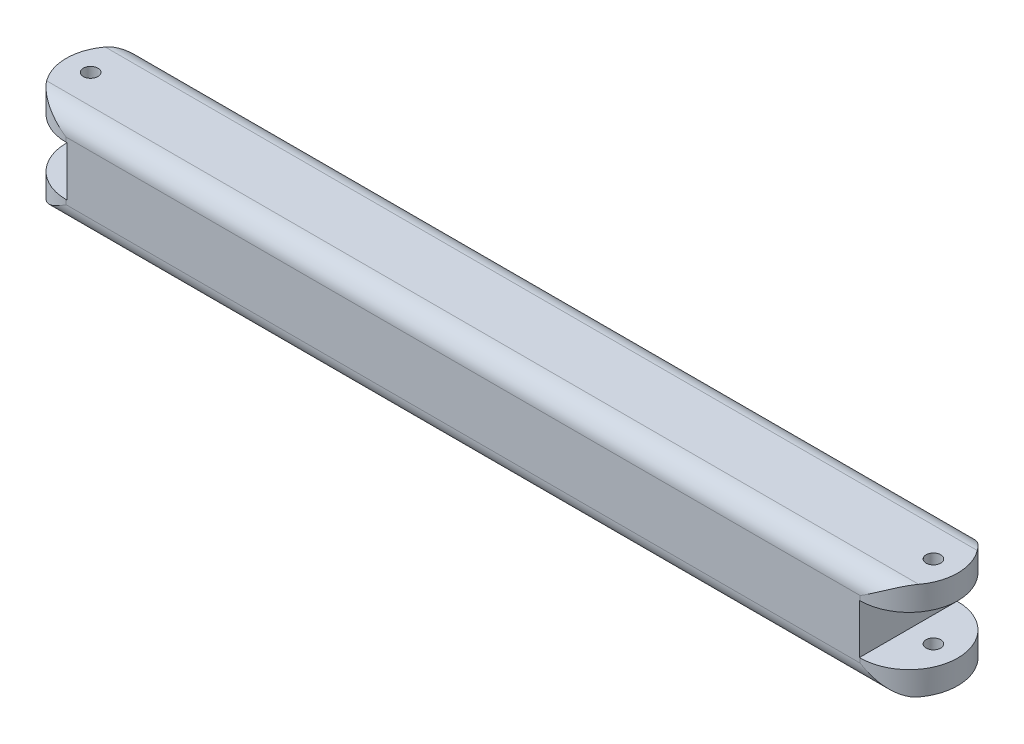
ISO-10303-21;
HEADER;
FILE_DESCRIPTION(('STEP AP214'),'2;1');
FILE_NAME('part.step','',(''),(''),'','','');
FILE_SCHEMA(('AUTOMOTIVE_DESIGN { 1 0 10303 214 1 1 1 1 }'));
ENDSEC;
DATA;
#1=APPLICATION_CONTEXT('core data for automotive mechanical design processes');
#2=APPLICATION_PROTOCOL_DEFINITION('international standard','automotive_design',2000,#1);
#3=PRODUCT_CONTEXT('',#1,'mechanical');
#4=PRODUCT('Part','Part','',(#3));
#5=PRODUCT_RELATED_PRODUCT_CATEGORY('part','',(#4));
#6=PRODUCT_DEFINITION_FORMATION('','',#4);
#7=PRODUCT_DEFINITION_CONTEXT('part definition',#1,'design');
#8=PRODUCT_DEFINITION('design','',#6,#7);
#9=PRODUCT_DEFINITION_SHAPE('','',#8);
#10=(LENGTH_UNIT() NAMED_UNIT(*) SI_UNIT(.MILLI.,.METRE.));
#11=(NAMED_UNIT(*) PLANE_ANGLE_UNIT() SI_UNIT($,.RADIAN.));
#12=(NAMED_UNIT(*) SI_UNIT($,.STERADIAN.) SOLID_ANGLE_UNIT());
#13=UNCERTAINTY_MEASURE_WITH_UNIT(LENGTH_MEASURE(1.E-05),#10,'distance_accuracy_value','');
#14=(GEOMETRIC_REPRESENTATION_CONTEXT(3) GLOBAL_UNCERTAINTY_ASSIGNED_CONTEXT((#13)) GLOBAL_UNIT_ASSIGNED_CONTEXT((#10,
#11,#12)) REPRESENTATION_CONTEXT('',''));
#15=CARTESIAN_POINT('',(0.,0.,0.));
#16=DIRECTION('',(0.,0.,1.));
#17=DIRECTION('',(1.,0.,0.));
#18=AXIS2_PLACEMENT_3D('',#15,#16,#17);
#19=CARTESIAN_POINT('',(228.4,-25.,15.));
#20=DIRECTION('',(0.,1.,0.));
#21=DIRECTION('',(0.,0.,1.));
#22=AXIS2_PLACEMENT_3D('',#19,#20,#21);
#23=PLANE('',#22);
#24=CARTESIAN_POINT('',(215.9,-25.,0.));
#25=DIRECTION('',(0.,1.,0.));
#26=DIRECTION('',(0.,0.,1.));
#27=AXIS2_PLACEMENT_3D('',#24,#25,#26);
#28=CIRCLE('',#27,3.75000000000001);
#29=CARTESIAN_POINT('',(215.9,-25.,3.75000000000001));
#30=VERTEX_POINT('',#29);
#31=EDGE_CURVE('E550',#30,#30,#28,.T.);
#32=ORIENTED_EDGE('',*,*,#31,.T.);
#33=EDGE_LOOP('',(#32));
#34=FACE_BOUND('',#33,.T.);
#35=CARTESIAN_POINT('',(-215.9,-25.,0.));
#36=DIRECTION('',(0.,1.,0.));
#37=DIRECTION('',(0.,0.,1.));
#38=AXIS2_PLACEMENT_3D('',#35,#36,#37);
#39=CIRCLE('',#38,3.75000000000001);
#40=CARTESIAN_POINT('',(-215.9,-25.,3.75000000000001));
#41=VERTEX_POINT('',#40);
#42=EDGE_CURVE('E156',#41,#41,#39,.T.);
#43=ORIENTED_EDGE('',*,*,#42,.T.);
#44=EDGE_LOOP('',(#43));
#45=FACE_BOUND('',#44,.T.);
#46=DIRECTION('',(-1.,0.,0.));
#47=VECTOR('',#46,1.);
#48=CARTESIAN_POINT('',(228.4,-25.,-15.));
#49=LINE('',#48,#47);
#50=CARTESIAN_POINT('',(223.4,-25.,-15.));
#51=VERTEX_POINT('',#50);
#52=CARTESIAN_POINT('',(-223.4,-25.,-15.));
#53=VERTEX_POINT('',#52);
#54=EDGE_CURVE('E182',#51,#53,#49,.T.);
#55=ORIENTED_EDGE('',*,*,#54,.F.);
#56=CARTESIAN_POINT('',(203.4,-25.,0.));
#57=DIRECTION('',(0.,-1.,0.));
#58=DIRECTION('',(0.,0.,-1.));
#59=AXIS2_PLACEMENT_3D('',#56,#57,#58);
#60=CIRCLE('',#59,25.);
#61=CARTESIAN_POINT('',(223.4,-25.,15.));
#62=VERTEX_POINT('',#61);
#63=EDGE_CURVE('E155',#51,#62,#60,.T.);
#64=ORIENTED_EDGE('',*,*,#63,.T.);
#65=DIRECTION('',(-1.,0.,0.));
#66=VECTOR('',#65,1.);
#67=CARTESIAN_POINT('',(228.4,-25.,15.));
#68=LINE('',#67,#66);
#69=CARTESIAN_POINT('',(-223.4,-25.,15.));
#70=VERTEX_POINT('',#69);
#71=EDGE_CURVE('E185',#62,#70,#68,.T.);
#72=ORIENTED_EDGE('',*,*,#71,.T.);
#73=CARTESIAN_POINT('',(-203.4,-25.,0.));
#74=DIRECTION('',(0.,-1.,0.));
#75=DIRECTION('',(0.,0.,1.));
#76=AXIS2_PLACEMENT_3D('',#73,#74,#75);
#77=CIRCLE('',#76,25.);
#78=EDGE_CURVE('E542',#70,#53,#77,.T.);
#79=ORIENTED_EDGE('',*,*,#78,.T.);
#80=EDGE_LOOP('',(#55,#64,#72,#79));
#81=FACE_BOUND('',#80,.T.);
#82=ADVANCED_FACE('F33',(#34,#45,#81),#23,.F.);
#83=CARTESIAN_POINT('',(228.4,25.,15.));
#84=DIRECTION('',(0.,1.,0.));
#85=DIRECTION('',(0.,0.,1.));
#86=AXIS2_PLACEMENT_3D('',#83,#84,#85);
#87=PLANE('',#86);
#88=CARTESIAN_POINT('',(215.9,25.,0.));
#89=DIRECTION('',(0.,1.,0.));
#90=DIRECTION('',(0.,0.,1.));
#91=AXIS2_PLACEMENT_3D('',#88,#89,#90);
#92=CIRCLE('',#91,3.75000000000001);
#93=CARTESIAN_POINT('',(215.9,25.,3.75000000000001));
#94=VERTEX_POINT('',#93);
#95=EDGE_CURVE('E538',#94,#94,#92,.T.);
#96=ORIENTED_EDGE('',*,*,#95,.F.);
#97=EDGE_LOOP('',(#96));
#98=FACE_BOUND('',#97,.T.);
#99=CARTESIAN_POINT('',(-215.9,25.,0.));
#100=DIRECTION('',(0.,1.,0.));
#101=DIRECTION('',(0.,0.,1.));
#102=AXIS2_PLACEMENT_3D('',#99,#100,#101);
#103=CIRCLE('',#102,3.75000000000001);
#104=CARTESIAN_POINT('',(-215.9,25.,3.75000000000001));
#105=VERTEX_POINT('',#104);
#106=EDGE_CURVE('E547',#105,#105,#103,.T.);
#107=ORIENTED_EDGE('',*,*,#106,.F.);
#108=EDGE_LOOP('',(#107));
#109=FACE_BOUND('',#108,.T.);
#110=CARTESIAN_POINT('',(203.4,25.,0.));
#111=DIRECTION('',(0.,-1.,0.));
#112=DIRECTION('',(0.,0.,-1.));
#113=AXIS2_PLACEMENT_3D('',#110,#111,#112);
#114=CIRCLE('',#113,25.);
#115=CARTESIAN_POINT('',(223.4,25.,-15.));
#116=VERTEX_POINT('',#115);
#117=CARTESIAN_POINT('',(223.4,25.,15.));
#118=VERTEX_POINT('',#117);
#119=EDGE_CURVE('E147',#116,#118,#114,.T.);
#120=ORIENTED_EDGE('',*,*,#119,.F.);
#121=DIRECTION('',(-1.,0.,0.));
#122=VECTOR('',#121,1.);
#123=CARTESIAN_POINT('',(228.4,25.,-15.));
#124=LINE('',#123,#122);
#125=CARTESIAN_POINT('',(-223.4,25.,-15.));
#126=VERTEX_POINT('',#125);
#127=EDGE_CURVE('E151',#116,#126,#124,.T.);
#128=ORIENTED_EDGE('',*,*,#127,.T.);
#129=CARTESIAN_POINT('',(-203.4,25.,0.));
#130=DIRECTION('',(0.,-1.,0.));
#131=DIRECTION('',(0.,0.,1.));
#132=AXIS2_PLACEMENT_3D('',#129,#130,#131);
#133=CIRCLE('',#132,25.);
#134=CARTESIAN_POINT('',(-223.4,25.,15.));
#135=VERTEX_POINT('',#134);
#136=EDGE_CURVE('E544',#135,#126,#133,.T.);
#137=ORIENTED_EDGE('',*,*,#136,.F.);
#138=DIRECTION('',(-1.,0.,0.));
#139=VECTOR('',#138,1.);
#140=CARTESIAN_POINT('',(228.4,25.,15.));
#141=LINE('',#140,#139);
#142=EDGE_CURVE('E153',#118,#135,#141,.T.);
#143=ORIENTED_EDGE('',*,*,#142,.F.);
#144=EDGE_LOOP('',(#120,#128,#137,#143));
#145=FACE_BOUND('',#144,.T.);
#146=ADVANCED_FACE('F149',(#98,#109,#145),#87,.T.);
#147=CARTESIAN_POINT('',(-228.4,12.7,-25.));
#148=DIRECTION('',(0.,1.,0.));
#149=DIRECTION('',(-1.,0.,0.));
#150=AXIS2_PLACEMENT_3D('',#147,#148,#149);
#151=PLANE('',#150);
#152=DIRECTION('',(-1.,0.,0.));
#153=VECTOR('',#152,1.);
#154=CARTESIAN_POINT('',(-228.4,12.7,25.));
#155=LINE('',#154,#153);
#156=CARTESIAN_POINT('',(-203.,12.7,25.));
#157=VERTEX_POINT('',#156);
#158=CARTESIAN_POINT('',(-203.4,12.7,25.));
#159=VERTEX_POINT('',#158);
#160=EDGE_CURVE('E237',#157,#159,#155,.T.);
#161=ORIENTED_EDGE('',*,*,#160,.T.);
#162=CARTESIAN_POINT('',(-203.4,12.7,0.));
#163=DIRECTION('',(0.,1.,0.));
#164=DIRECTION('',(-1.,0.,0.));
#165=AXIS2_PLACEMENT_3D('',#162,#163,#164);
#166=CIRCLE('',#165,25.);
#167=CARTESIAN_POINT('',(-203.4,12.7,-25.));
#168=VERTEX_POINT('',#167);
#169=EDGE_CURVE('E272',#159,#168,#166,.F.);
#170=ORIENTED_EDGE('',*,*,#169,.T.);
#171=DIRECTION('',(-1.,0.,0.));
#172=VECTOR('',#171,1.);
#173=CARTESIAN_POINT('',(-228.4,12.7,-25.));
#174=LINE('',#173,#172);
#175=CARTESIAN_POINT('',(-203.,12.7,-25.));
#176=VERTEX_POINT('',#175);
#177=EDGE_CURVE('E240',#176,#168,#174,.T.);
#178=ORIENTED_EDGE('',*,*,#177,.F.);
#179=DIRECTION('',(0.,0.,1.));
#180=VECTOR('',#179,1.);
#181=CARTESIAN_POINT('',(-203.,12.7,-25.));
#182=LINE('',#181,#180);
#183=EDGE_CURVE('E228',#176,#157,#182,.T.);
#184=ORIENTED_EDGE('',*,*,#183,.T.);
#185=EDGE_LOOP('',(#161,#170,#178,#184));
#186=FACE_BOUND('',#185,.T.);
#187=CARTESIAN_POINT('',(-215.9,12.7,0.));
#188=DIRECTION('',(0.,1.,0.));
#189=DIRECTION('',(-1.,0.,0.));
#190=AXIS2_PLACEMENT_3D('',#187,#188,#189);
#191=CIRCLE('',#190,3.75000000000001);
#192=CARTESIAN_POINT('',(-219.65,12.7,0.));
#193=VERTEX_POINT('',#192);
#194=EDGE_CURVE('E247',#193,#193,#191,.T.);
#195=ORIENTED_EDGE('',*,*,#194,.T.);
#196=EDGE_LOOP('',(#195));
#197=FACE_BOUND('',#196,.T.);
#198=ADVANCED_FACE('F269',(#186,#197),#151,.F.);
#199=CARTESIAN_POINT('',(-228.4,-12.7,-25.));
#200=DIRECTION('',(0.,-1.,0.));
#201=DIRECTION('',(1.,0.,0.));
#202=AXIS2_PLACEMENT_3D('',#199,#200,#201);
#203=PLANE('',#202);
#204=DIRECTION('',(1.,0.,0.));
#205=VECTOR('',#204,1.);
#206=CARTESIAN_POINT('',(-228.4,-12.7,-25.));
#207=LINE('',#206,#205);
#208=CARTESIAN_POINT('',(-203.4,-12.7,-25.));
#209=VERTEX_POINT('',#208);
#210=CARTESIAN_POINT('',(-203.,-12.7,-25.));
#211=VERTEX_POINT('',#210);
#212=EDGE_CURVE('E234',#209,#211,#207,.T.);
#213=ORIENTED_EDGE('',*,*,#212,.F.);
#214=CARTESIAN_POINT('',(-203.4,-12.7,0.));
#215=DIRECTION('',(0.,-1.,0.));
#216=DIRECTION('',(1.,0.,0.));
#217=AXIS2_PLACEMENT_3D('',#214,#215,#216);
#218=CIRCLE('',#217,25.);
#219=CARTESIAN_POINT('',(-203.4,-12.7,25.));
#220=VERTEX_POINT('',#219);
#221=EDGE_CURVE('E11',#209,#220,#218,.F.);
#222=ORIENTED_EDGE('',*,*,#221,.T.);
#223=DIRECTION('',(1.,0.,0.));
#224=VECTOR('',#223,1.);
#225=CARTESIAN_POINT('',(-228.4,-12.7,25.));
#226=LINE('',#225,#224);
#227=CARTESIAN_POINT('',(-203.,-12.7,25.));
#228=VERTEX_POINT('',#227);
#229=EDGE_CURVE('E244',#220,#228,#226,.T.);
#230=ORIENTED_EDGE('',*,*,#229,.T.);
#231=DIRECTION('',(0.,0.,1.));
#232=VECTOR('',#231,1.);
#233=CARTESIAN_POINT('',(-203.,-12.7,-25.));
#234=LINE('',#233,#232);
#235=EDGE_CURVE('E243',#211,#228,#234,.T.);
#236=ORIENTED_EDGE('',*,*,#235,.F.);
#237=EDGE_LOOP('',(#213,#222,#230,#236));
#238=FACE_BOUND('',#237,.T.);
#239=CARTESIAN_POINT('',(-215.9,-12.7,0.));
#240=DIRECTION('',(0.,-1.,0.));
#241=DIRECTION('',(1.,0.,0.));
#242=AXIS2_PLACEMENT_3D('',#239,#240,#241);
#243=CIRCLE('',#242,3.75000000000001);
#244=CARTESIAN_POINT('',(-212.15,-12.7,0.));
#245=VERTEX_POINT('',#244);
#246=EDGE_CURVE('E38',#245,#245,#243,.T.);
#247=ORIENTED_EDGE('',*,*,#246,.T.);
#248=EDGE_LOOP('',(#247));
#249=FACE_BOUND('',#248,.T.);
#250=ADVANCED_FACE('F276',(#238,#249),#203,.F.);
#251=CARTESIAN_POINT('',(228.4,15.,15.));
#252=DIRECTION('',(-1.,0.,0.));
#253=DIRECTION('',(0.,0.,1.));
#254=AXIS2_PLACEMENT_3D('',#251,#252,#253);
#255=CYLINDRICAL_SURFACE('',#254,10.);
#256=DIRECTION('',(-1.,0.,0.));
#257=VECTOR('',#256,1.);
#258=CARTESIAN_POINT('',(228.4,15.,25.));
#259=LINE('',#258,#257);
#260=CARTESIAN_POINT('',(203.4,15.,25.));
#261=VERTEX_POINT('',#260);
#262=CARTESIAN_POINT('',(-203.4,15.,25.));
#263=VERTEX_POINT('',#262);
#264=EDGE_CURVE('E191',#261,#263,#259,.T.);
#265=ORIENTED_EDGE('',*,*,#264,.F.);
#266=CARTESIAN_POINT('',(223.4,25.,15.));
#267=CARTESIAN_POINT('',(223.271763336507,24.9999976759588,15.1709880189507));
#268=CARTESIAN_POINT('',(223.141355066891,24.9956146661704,15.3402907999127));
#269=CARTESIAN_POINT('',(222.876482538178,24.9785877114108,15.6752087704411));
#270=CARTESIAN_POINT('',(222.742019238699,24.9659457065147,15.8408248165925));
#271=CARTESIAN_POINT('',(222.333398058913,24.916440337762,16.3311716573216));
#272=CARTESIAN_POINT('',(222.053525086562,24.8679938045157,16.6500457065071));
#273=CARTESIAN_POINT('',(221.48356842311,24.744615734556,17.2672946088825));
#274=CARTESIAN_POINT('',(221.193607059594,24.6699402963025,17.5658354885525));
#275=CARTESIAN_POINT('',(220.602635302288,24.4973881069269,18.1449894900588));
#276=CARTESIAN_POINT('',(220.301618521017,24.3994977588845,18.4255919826811));
#277=CARTESIAN_POINT('',(219.560547821999,24.1377805429409,19.0833824324016));
#278=CARTESIAN_POINT('',(219.115677718771,23.9635978608164,19.4510527486094));
#279=CARTESIAN_POINT('',(218.210898106238,23.5819918022889,20.1485453369412));
#280=CARTESIAN_POINT('',(217.750984842789,23.3745600771529,20.478358067352));
#281=CARTESIAN_POINT('',(216.816522761849,22.9314005200255,21.1024732299253));
#282=CARTESIAN_POINT('',(216.341905321091,22.6955177441085,21.3965619385709));
#283=CARTESIAN_POINT('',(215.383066756385,22.2016059064507,21.9479390614612));
#284=CARTESIAN_POINT('',(214.898845452051,21.9435764284342,22.2052267837415));
#285=CARTESIAN_POINT('',(213.72031223322,21.2989189366857,22.7833848589762));
#286=CARTESIAN_POINT('',(213.022112012779,20.903318969618,23.0864054907695));
#287=CARTESIAN_POINT('',(211.614528711219,20.0859992483539,23.6239172225299));
#288=CARTESIAN_POINT('',(210.905140303674,19.6642667549962,23.8583745754514));
#289=CARTESIAN_POINT('',(209.480220711079,18.8034314282994,24.2606234230266));
#290=CARTESIAN_POINT('',(208.764704581266,18.3643648784774,24.4285468144983));
#291=CARTESIAN_POINT('',(207.32917438167,17.4747206098236,24.7000987400741));
#292=CARTESIAN_POINT('',(206.609162890722,17.0241491014312,24.803761229326));
#293=CARTESIAN_POINT('',(205.478198024298,16.3128855297268,24.9168757994347));
#294=CARTESIAN_POINT('',(205.067992801265,16.054182821872,24.9476792190522));
#295=CARTESIAN_POINT('',(204.247416623937,15.5359457002117,24.9890078509951));
#296=CARTESIAN_POINT('',(203.837045981119,15.2764119864121,24.9995470909869));
#297=CARTESIAN_POINT('',(203.417817392337,15.0112687081692,24.9999952375286));
#298=CARTESIAN_POINT('',(203.408908682789,15.0056343455262,24.9999999993762));
#299=CARTESIAN_POINT('',(203.4,15.,25.));
#300=B_SPLINE_CURVE_WITH_KNOTS('',3,(#266,#267,#268,#269,#270,#271,#272,#273,#274,#275,#276,
#277,#278,#279,#280,#281,#282,#283,#284,#285,#286,#287,#288,#289,#290,#291,#292,#293,#294,#295,
#296,#297,#298,#299),.UNSPECIFIED.,.F.,.F.,(4,2,2,2,2,2,2,2,2,2,2,2,2,2,2,2,4),(0.,
0.641056070171649,1.28196160750526,2.56136388056294,3.82860629405276,5.09659276966346,
6.90242325463777,8.70870789050477,10.5253159063433,12.3419580751451,14.9115990743969,
17.4825027378172,20.0482840358865,22.6127084294151,24.0702047217287,25.5266917137071,
25.5583144935356),.UNSPECIFIED.);
#301=EDGE_CURVE('E370',#261,#118,#300,.F.);
#302=ORIENTED_EDGE('',*,*,#301,.T.);
#303=ORIENTED_EDGE('',*,*,#142,.T.);
#304=CARTESIAN_POINT('',(-223.4,25.,15.));
#305=CARTESIAN_POINT('',(-223.271763336507,24.9999976759588,15.1709880189507));
#306=CARTESIAN_POINT('',(-223.141355066891,24.9956146661704,15.3402907999127));
#307=CARTESIAN_POINT('',(-222.876482538178,24.9785877114108,15.6752087704411));
#308=CARTESIAN_POINT('',(-222.742019238699,24.9659457065147,15.8408248165925));
#309=CARTESIAN_POINT('',(-222.333398058913,24.916440337762,16.3311716573216));
#310=CARTESIAN_POINT('',(-222.053525086562,24.8679938045157,16.6500457065071));
#311=CARTESIAN_POINT('',(-221.48356842311,24.744615734556,17.2672946088825));
#312=CARTESIAN_POINT('',(-221.193607059594,24.6699402963025,17.5658354885525));
#313=CARTESIAN_POINT('',(-220.602635302288,24.4973881069269,18.1449894900588));
#314=CARTESIAN_POINT('',(-220.301618521017,24.3994977588845,18.4255919826811));
#315=CARTESIAN_POINT('',(-219.560547821999,24.1377805429409,19.0833824324016));
#316=CARTESIAN_POINT('',(-219.115677718771,23.9635978608164,19.4510527486094));
#317=CARTESIAN_POINT('',(-218.210898106238,23.5819918022889,20.1485453369412));
#318=CARTESIAN_POINT('',(-217.750984842789,23.3745600771529,20.478358067352));
#319=CARTESIAN_POINT('',(-216.816522761849,22.9314005200255,21.1024732299253));
#320=CARTESIAN_POINT('',(-216.341905321091,22.6955177441085,21.3965619385709));
#321=CARTESIAN_POINT('',(-215.383066756385,22.2016059064507,21.9479390614612));
#322=CARTESIAN_POINT('',(-214.898845452051,21.9435764284342,22.2052267837415));
#323=CARTESIAN_POINT('',(-213.72031223322,21.2989189366857,22.7833848589762));
#324=CARTESIAN_POINT('',(-213.022112012779,20.903318969618,23.0864054907695));
#325=CARTESIAN_POINT('',(-211.614528711219,20.0859992483539,23.6239172225299));
#326=CARTESIAN_POINT('',(-210.905140303674,19.6642667549962,23.8583745754514));
#327=CARTESIAN_POINT('',(-209.480220711079,18.8034314282994,24.2606234230266));
#328=CARTESIAN_POINT('',(-208.764704581266,18.3643648784774,24.4285468144983));
#329=CARTESIAN_POINT('',(-207.32917438167,17.4747206098236,24.7000987400741));
#330=CARTESIAN_POINT('',(-206.609162890722,17.0241491014312,24.803761229326));
#331=CARTESIAN_POINT('',(-205.478198024298,16.3128855297268,24.9168757994347));
#332=CARTESIAN_POINT('',(-205.067992801265,16.054182821872,24.9476792190522));
#333=CARTESIAN_POINT('',(-204.247416623937,15.5359457002117,24.9890078509951));
#334=CARTESIAN_POINT('',(-203.837045981119,15.2764119864121,24.9995470909869));
#335=CARTESIAN_POINT('',(-203.417817392337,15.0112687081692,24.9999952375286));
#336=CARTESIAN_POINT('',(-203.408908682789,15.0056343455262,24.9999999993762));
#337=CARTESIAN_POINT('',(-203.4,15.,25.));
#338=B_SPLINE_CURVE_WITH_KNOTS('',3,(#304,#305,#306,#307,#308,#309,#310,#311,#312,#313,#314,
#315,#316,#317,#318,#319,#320,#321,#322,#323,#324,#325,#326,#327,#328,#329,#330,#331,#332,#333,
#334,#335,#336,#337),.UNSPECIFIED.,.F.,.F.,(4,2,2,2,2,2,2,2,2,2,2,2,2,2,2,2,4),(0.,
0.641056070171649,1.28196160750526,2.56136388056294,3.82860629405276,5.09659276966346,
6.90242325463777,8.70870789050477,10.5253159063433,12.3419580751451,14.9115990743969,
17.4825027378172,20.0482840358865,22.6127084294151,24.0702047217287,25.5266917137071,
25.5583144935356),.UNSPECIFIED.);
#339=EDGE_CURVE('E291',#135,#263,#338,.T.);
#340=ORIENTED_EDGE('',*,*,#339,.T.);
#341=EDGE_LOOP('',(#265,#302,#303,#340));
#342=FACE_BOUND('',#341,.T.);
#343=ADVANCED_FACE('F35',(#342),#255,.T.);
#344=CARTESIAN_POINT('',(228.4,15.,25.));
#345=DIRECTION('',(0.,0.,-1.));
#346=DIRECTION('',(-1.,0.,0.));
#347=AXIS2_PLACEMENT_3D('',#344,#345,#346);
#348=PLANE('',#347);
#349=DIRECTION('',(-1.,0.,0.));
#350=VECTOR('',#349,1.);
#351=CARTESIAN_POINT('',(228.4,-15.,25.));
#352=LINE('',#351,#350);
#353=CARTESIAN_POINT('',(203.4,-15.,25.));
#354=VERTEX_POINT('',#353);
#355=CARTESIAN_POINT('',(-203.4,-15.,25.));
#356=VERTEX_POINT('',#355);
#357=EDGE_CURVE('E188',#354,#356,#352,.T.);
#358=ORIENTED_EDGE('',*,*,#357,.F.);
#359=DIRECTION('',(0.,1.,0.));
#360=VECTOR('',#359,1.);
#361=CARTESIAN_POINT('',(203.4,-25.,25.));
#362=LINE('',#361,#360);
#363=CARTESIAN_POINT('',(203.4,-12.7,25.));
#364=VERTEX_POINT('',#363);
#365=EDGE_CURVE('E554',#354,#364,#362,.T.);
#366=ORIENTED_EDGE('',*,*,#365,.T.);
#367=DIRECTION('',(1.,0.,0.));
#368=VECTOR('',#367,1.);
#369=CARTESIAN_POINT('',(203.,-12.7,25.));
#370=LINE('',#369,#368);
#371=CARTESIAN_POINT('',(203.,-12.7,25.));
#372=VERTEX_POINT('',#371);
#373=EDGE_CURVE('E207',#372,#364,#370,.T.);
#374=ORIENTED_EDGE('',*,*,#373,.F.);
#375=DIRECTION('',(0.,-1.,0.));
#376=VECTOR('',#375,1.);
#377=CARTESIAN_POINT('',(203.,12.7,25.));
#378=LINE('',#377,#376);
#379=CARTESIAN_POINT('',(203.,12.7,25.));
#380=VERTEX_POINT('',#379);
#381=EDGE_CURVE('E225',#380,#372,#378,.T.);
#382=ORIENTED_EDGE('',*,*,#381,.F.);
#383=DIRECTION('',(-1.,0.,0.));
#384=VECTOR('',#383,1.);
#385=CARTESIAN_POINT('',(203.,12.7,25.));
#386=LINE('',#385,#384);
#387=CARTESIAN_POINT('',(203.4,12.7,25.));
#388=VERTEX_POINT('',#387);
#389=EDGE_CURVE('E221',#388,#380,#386,.T.);
#390=ORIENTED_EDGE('',*,*,#389,.F.);
#391=EDGE_CURVE('E57',#388,#261,#362,.T.);
#392=ORIENTED_EDGE('',*,*,#391,.T.);
#393=ORIENTED_EDGE('',*,*,#264,.T.);
#394=DIRECTION('',(0.,1.,0.));
#395=VECTOR('',#394,1.);
#396=CARTESIAN_POINT('',(-203.4,-25.,25.));
#397=LINE('',#396,#395);
#398=EDGE_CURVE('E266',#159,#263,#397,.T.);
#399=ORIENTED_EDGE('',*,*,#398,.F.);
#400=ORIENTED_EDGE('',*,*,#160,.F.);
#401=DIRECTION('',(0.,1.,0.));
#402=VECTOR('',#401,1.);
#403=CARTESIAN_POINT('',(-203.,12.7,25.));
#404=LINE('',#403,#402);
#405=EDGE_CURVE('E246',#228,#157,#404,.T.);
#406=ORIENTED_EDGE('',*,*,#405,.F.);
#407=ORIENTED_EDGE('',*,*,#229,.F.);
#408=EDGE_CURVE('E50',#356,#220,#397,.T.);
#409=ORIENTED_EDGE('',*,*,#408,.F.);
#410=EDGE_LOOP('',(#358,#366,#374,#382,#390,#392,#393,#399,#400,#406,#407,#409));
#411=FACE_BOUND('',#410,.T.);
#412=ADVANCED_FACE('F264',(#411),#348,.F.);
#413=CARTESIAN_POINT('',(228.4,-15.,15.));
#414=DIRECTION('',(-1.,0.,0.));
#415=DIRECTION('',(0.,0.,1.));
#416=AXIS2_PLACEMENT_3D('',#413,#414,#415);
#417=CYLINDRICAL_SURFACE('',#416,10.);
#418=ORIENTED_EDGE('',*,*,#71,.F.);
#419=CARTESIAN_POINT('',(223.4,-25.,15.));
#420=CARTESIAN_POINT('',(223.271763336507,-24.9999976759589,15.1709880189507));
#421=CARTESIAN_POINT('',(223.141355066891,-24.9956146661704,15.3402907999127));
#422=CARTESIAN_POINT('',(222.876482538178,-24.9785877114108,15.675208770441));
#423=CARTESIAN_POINT('',(222.742019238699,-24.9659457065148,15.8408248165924));
#424=CARTESIAN_POINT('',(222.333398058913,-24.9164403377621,16.3311716573214));
#425=CARTESIAN_POINT('',(222.053525086562,-24.8679938045158,16.6500457065069));
#426=CARTESIAN_POINT('',(221.48356842311,-24.7446157345561,17.2672946088823));
#427=CARTESIAN_POINT('',(221.193607059594,-24.6699402963026,17.5658354885523));
#428=CARTESIAN_POINT('',(220.602635302288,-24.4973881069269,18.1449894900587));
#429=CARTESIAN_POINT('',(220.301618521017,-24.3994977588845,18.425591982681));
#430=CARTESIAN_POINT('',(219.560547821999,-24.1377805429409,19.0833824324016));
#431=CARTESIAN_POINT('',(219.115677718771,-23.9635978608164,19.4510527486095));
#432=CARTESIAN_POINT('',(218.210898106238,-23.5819918022889,20.1485453369413));
#433=CARTESIAN_POINT('',(217.750984842789,-23.3745600771528,20.4783580673521));
#434=CARTESIAN_POINT('',(216.816522761848,-22.9314005200255,21.1024732299254));
#435=CARTESIAN_POINT('',(216.341905321091,-22.6955177441084,21.396561938571));
#436=CARTESIAN_POINT('',(215.383066756385,-22.2016059064507,21.9479390614612));
#437=CARTESIAN_POINT('',(214.898845452051,-21.9435764284342,22.2052267837415));
#438=CARTESIAN_POINT('',(213.72031223322,-21.2989189366857,22.7833848589761));
#439=CARTESIAN_POINT('',(213.022112012779,-20.903318969618,23.0864054907695));
#440=CARTESIAN_POINT('',(211.614528711219,-20.085999248354,23.6239172225299));
#441=CARTESIAN_POINT('',(210.905140303675,-19.6642667549964,23.8583745754513));
#442=CARTESIAN_POINT('',(209.48022071108,-18.8034314282995,24.2606234230266));
#443=CARTESIAN_POINT('',(208.764704581266,-18.3643648784772,24.4285468144982));
#444=CARTESIAN_POINT('',(207.32917438167,-17.4747206098241,24.7000987400741));
#445=CARTESIAN_POINT('',(206.609162890721,-17.0241491014326,24.803761229326));
#446=CARTESIAN_POINT('',(205.478198024299,-16.3128855297261,24.9168757994347));
#447=CARTESIAN_POINT('',(205.067992801267,-16.0541828218697,24.9476792190523));
#448=CARTESIAN_POINT('',(204.247416623935,-15.5359457002141,24.9890078509951));
#449=CARTESIAN_POINT('',(203.837045981113,-15.2764119864208,24.9995470909869));
#450=CARTESIAN_POINT('',(203.417817392337,-15.0112687081696,24.9999952375286));
#451=CARTESIAN_POINT('',(203.408908682788,-15.0056343455264,24.9999999993762));
#452=CARTESIAN_POINT('',(203.4,-15.,25.));
#453=B_SPLINE_CURVE_WITH_KNOTS('',3,(#419,#420,#421,#422,#423,#424,#425,#426,#427,#428,#429,
#430,#431,#432,#433,#434,#435,#436,#437,#438,#439,#440,#441,#442,#443,#444,#445,#446,#447,#448,
#449,#450,#451,#452),.UNSPECIFIED.,.F.,.F.,(4,2,2,2,2,2,2,2,2,2,2,2,2,2,2,2,4),(0.,
0.641056070171567,1.28196160750509,2.56136388056262,3.82860629405261,5.09659276966347,
6.90242325463793,8.70870789050507,10.5253159063434,12.3419580751451,14.9115990743967,
17.4825027378169,20.0482840358864,22.6127084294151,24.0702047217288,25.5266917137072,
25.5583144935357),.UNSPECIFIED.);
#454=EDGE_CURVE('E362',#62,#354,#453,.T.);
#455=ORIENTED_EDGE('',*,*,#454,.T.);
#456=ORIENTED_EDGE('',*,*,#357,.T.);
#457=CARTESIAN_POINT('',(-223.4,-25.,15.));
#458=CARTESIAN_POINT('',(-223.271763336507,-24.9999976759589,15.1709880189507));
#459=CARTESIAN_POINT('',(-223.141355066891,-24.9956146661704,15.3402907999127));
#460=CARTESIAN_POINT('',(-222.876482538178,-24.9785877114108,15.675208770441));
#461=CARTESIAN_POINT('',(-222.742019238699,-24.9659457065148,15.8408248165924));
#462=CARTESIAN_POINT('',(-222.333398058913,-24.9164403377621,16.3311716573214));
#463=CARTESIAN_POINT('',(-222.053525086562,-24.8679938045158,16.6500457065069));
#464=CARTESIAN_POINT('',(-221.48356842311,-24.7446157345561,17.2672946088823));
#465=CARTESIAN_POINT('',(-221.193607059594,-24.6699402963026,17.5658354885523));
#466=CARTESIAN_POINT('',(-220.602635302288,-24.4973881069269,18.1449894900587));
#467=CARTESIAN_POINT('',(-220.301618521017,-24.3994977588845,18.425591982681));
#468=CARTESIAN_POINT('',(-219.560547821999,-24.1377805429409,19.0833824324016));
#469=CARTESIAN_POINT('',(-219.115677718771,-23.9635978608164,19.4510527486095));
#470=CARTESIAN_POINT('',(-218.210898106238,-23.5819918022889,20.1485453369413));
#471=CARTESIAN_POINT('',(-217.750984842789,-23.3745600771528,20.4783580673521));
#472=CARTESIAN_POINT('',(-216.816522761848,-22.9314005200255,21.1024732299254));
#473=CARTESIAN_POINT('',(-216.341905321091,-22.6955177441084,21.396561938571));
#474=CARTESIAN_POINT('',(-215.383066756385,-22.2016059064507,21.9479390614612));
#475=CARTESIAN_POINT('',(-214.898845452051,-21.9435764284342,22.2052267837415));
#476=CARTESIAN_POINT('',(-213.72031223322,-21.2989189366857,22.7833848589761));
#477=CARTESIAN_POINT('',(-213.022112012779,-20.903318969618,23.0864054907695));
#478=CARTESIAN_POINT('',(-211.614528711219,-20.085999248354,23.6239172225299));
#479=CARTESIAN_POINT('',(-210.905140303675,-19.6642667549964,23.8583745754513));
#480=CARTESIAN_POINT('',(-209.48022071108,-18.8034314282995,24.2606234230266));
#481=CARTESIAN_POINT('',(-208.764704581266,-18.3643648784772,24.4285468144982));
#482=CARTESIAN_POINT('',(-207.32917438167,-17.4747206098241,24.7000987400741));
#483=CARTESIAN_POINT('',(-206.609162890721,-17.0241491014326,24.803761229326));
#484=CARTESIAN_POINT('',(-205.478198024299,-16.3128855297261,24.9168757994347));
#485=CARTESIAN_POINT('',(-205.067992801267,-16.0541828218697,24.9476792190523));
#486=CARTESIAN_POINT('',(-204.247416623935,-15.5359457002141,24.9890078509951));
#487=CARTESIAN_POINT('',(-203.837045981113,-15.2764119864208,24.9995470909869));
#488=CARTESIAN_POINT('',(-203.417817392337,-15.0112687081696,24.9999952375286));
#489=CARTESIAN_POINT('',(-203.408908682788,-15.0056343455264,24.9999999993762));
#490=CARTESIAN_POINT('',(-203.4,-15.,25.));
#491=B_SPLINE_CURVE_WITH_KNOTS('',3,(#457,#458,#459,#460,#461,#462,#463,#464,#465,#466,#467,
#468,#469,#470,#471,#472,#473,#474,#475,#476,#477,#478,#479,#480,#481,#482,#483,#484,#485,#486,
#487,#488,#489,#490),.UNSPECIFIED.,.F.,.F.,(4,2,2,2,2,2,2,2,2,2,2,2,2,2,2,2,4),(0.,
0.641056070171567,1.28196160750509,2.56136388056262,3.82860629405261,5.09659276966347,
6.90242325463793,8.70870789050507,10.5253159063434,12.3419580751451,14.9115990743967,
17.4825027378169,20.0482840358864,22.6127084294151,24.0702047217288,25.5266917137072,
25.5583144935357),.UNSPECIFIED.);
#492=EDGE_CURVE('E288',#356,#70,#491,.F.);
#493=ORIENTED_EDGE('',*,*,#492,.T.);
#494=EDGE_LOOP('',(#418,#455,#456,#493));
#495=FACE_BOUND('',#494,.T.);
#496=ADVANCED_FACE('F356',(#495),#417,.T.);
#497=CARTESIAN_POINT('',(228.4,-15.,-15.));
#498=DIRECTION('',(-1.,0.,0.));
#499=DIRECTION('',(0.,0.,1.));
#500=AXIS2_PLACEMENT_3D('',#497,#498,#499);
#501=CYLINDRICAL_SURFACE('',#500,10.);
#502=DIRECTION('',(-1.,0.,0.));
#503=VECTOR('',#502,1.);
#504=CARTESIAN_POINT('',(228.4,-15.,-25.));
#505=LINE('',#504,#503);
#506=CARTESIAN_POINT('',(203.4,-15.,-25.));
#507=VERTEX_POINT('',#506);
#508=CARTESIAN_POINT('',(-203.4,-15.,-25.));
#509=VERTEX_POINT('',#508);
#510=EDGE_CURVE('E174',#507,#509,#505,.T.);
#511=ORIENTED_EDGE('',*,*,#510,.F.);
#512=CARTESIAN_POINT('',(223.4,-25.,-15.));
#513=CARTESIAN_POINT('',(223.271763336507,-24.9999976759589,-15.1709880189506));
#514=CARTESIAN_POINT('',(223.141355066891,-24.9956146661704,-15.3402907999124));
#515=CARTESIAN_POINT('',(222.876482538178,-24.9785877114108,-15.6752087704404));
#516=CARTESIAN_POINT('',(222.742019238699,-24.9659457065148,-15.8408248165917));
#517=CARTESIAN_POINT('',(222.333398058914,-24.9164403377622,-16.3311716573203));
#518=CARTESIAN_POINT('',(222.053525086563,-24.867993804516,-16.6500457065056));
#519=CARTESIAN_POINT('',(221.483568423112,-24.7446157345564,-17.2672946088811));
#520=CARTESIAN_POINT('',(221.193607059595,-24.6699402963028,-17.5658354885513));
#521=CARTESIAN_POINT('',(220.602635302288,-24.4973881069271,-18.1449894900583));
#522=CARTESIAN_POINT('',(220.301618521017,-24.3994977588846,-18.4255919826808));
#523=CARTESIAN_POINT('',(219.560547821999,-24.1377805429408,-19.0833824324018));
#524=CARTESIAN_POINT('',(219.11567771877,-23.9635978608162,-19.4510527486098));
#525=CARTESIAN_POINT('',(218.210898106237,-23.5819918022885,-20.148545336942));
#526=CARTESIAN_POINT('',(217.750984842788,-23.3745600771523,-20.4783580673529));
#527=CARTESIAN_POINT('',(216.816522761847,-22.9314005200249,-21.1024732299261));
#528=CARTESIAN_POINT('',(216.34190532109,-22.695517744108,-21.3965619385715));
#529=CARTESIAN_POINT('',(215.383066756384,-22.2016059064504,-21.9479390614615));
#530=CARTESIAN_POINT('',(214.89884545205,-21.9435764284341,-22.2052267837417));
#531=CARTESIAN_POINT('',(213.72031223322,-21.2989189366858,-22.783384858976));
#532=CARTESIAN_POINT('',(213.022112012779,-20.9033189696182,-23.0864054907692));
#533=CARTESIAN_POINT('',(211.61452871122,-20.0859992483548,-23.6239172225295));
#534=CARTESIAN_POINT('',(210.905140303675,-19.6642667549978,-23.8583745754509));
#535=CARTESIAN_POINT('',(209.480220711081,-18.8034314282995,-24.2606234230263));
#536=CARTESIAN_POINT('',(208.764704581269,-18.3643648784752,-24.4285468144981));
#537=CARTESIAN_POINT('',(207.329174381668,-17.4747206098268,-24.700098740074));
#538=CARTESIAN_POINT('',(206.609162890715,-17.0241491014419,-24.8037612293259));
#539=CARTESIAN_POINT('',(205.478198024302,-16.3128855297209,-24.9168757994347));
#540=CARTESIAN_POINT('',(205.067992801276,-16.0541828218541,-24.9476792190523));
#541=CARTESIAN_POINT('',(204.247416623925,-15.5359457002297,-24.9890078509951));
#542=CARTESIAN_POINT('',(203.837045981077,-15.276411986478,-24.9995470909869));
#543=CARTESIAN_POINT('',(203.417817392336,-15.011268708172,-24.9999952375286));
#544=CARTESIAN_POINT('',(203.408908682788,-15.0056343455276,-24.9999999993762));
#545=CARTESIAN_POINT('',(203.4,-15.,-25.));
#546=B_SPLINE_CURVE_WITH_KNOTS('',3,(#512,#513,#514,#515,#516,#517,#518,#519,#520,#521,#522,
#523,#524,#525,#526,#527,#528,#529,#530,#531,#532,#533,#534,#535,#536,#537,#538,#539,#540,#541,
#542,#543,#544,#545),.UNSPECIFIED.,.F.,.F.,(4,2,2,2,2,2,2,2,2,2,2,2,2,2,2,2,4),(0.,
0.641056070171015,1.28196160750402,2.56136388056045,3.82860629405153,5.09659276966345,
6.90242325463875,8.70870789050677,10.5253159063443,12.3419580751451,14.9115990743957,
17.4825027378153,20.0482840358857,22.6127084294152,24.0702047217289,25.5266917137072,
25.5583144935356),.UNSPECIFIED.);
#547=EDGE_CURVE('E166',#507,#51,#546,.F.);
#548=ORIENTED_EDGE('',*,*,#547,.T.);
#549=ORIENTED_EDGE('',*,*,#54,.T.);
#550=CARTESIAN_POINT('',(-223.4,-25.,-15.));
#551=CARTESIAN_POINT('',(-223.271763336507,-24.9999976759589,-15.1709880189506));
#552=CARTESIAN_POINT('',(-223.141355066891,-24.9956146661704,-15.3402907999124));
#553=CARTESIAN_POINT('',(-222.876482538178,-24.9785877114108,-15.6752087704404));
#554=CARTESIAN_POINT('',(-222.742019238699,-24.9659457065148,-15.8408248165917));
#555=CARTESIAN_POINT('',(-222.333398058914,-24.9164403377622,-16.3311716573203));
#556=CARTESIAN_POINT('',(-222.053525086563,-24.867993804516,-16.6500457065056));
#557=CARTESIAN_POINT('',(-221.483568423112,-24.7446157345564,-17.2672946088811));
#558=CARTESIAN_POINT('',(-221.193607059595,-24.6699402963028,-17.5658354885513));
#559=CARTESIAN_POINT('',(-220.602635302288,-24.4973881069271,-18.1449894900583));
#560=CARTESIAN_POINT('',(-220.301618521017,-24.3994977588846,-18.4255919826808));
#561=CARTESIAN_POINT('',(-219.560547821999,-24.1377805429408,-19.0833824324018));
#562=CARTESIAN_POINT('',(-219.11567771877,-23.9635978608162,-19.4510527486098));
#563=CARTESIAN_POINT('',(-218.210898106237,-23.5819918022885,-20.148545336942));
#564=CARTESIAN_POINT('',(-217.750984842788,-23.3745600771523,-20.4783580673529));
#565=CARTESIAN_POINT('',(-216.816522761847,-22.9314005200249,-21.1024732299261));
#566=CARTESIAN_POINT('',(-216.34190532109,-22.695517744108,-21.3965619385715));
#567=CARTESIAN_POINT('',(-215.383066756384,-22.2016059064504,-21.9479390614615));
#568=CARTESIAN_POINT('',(-214.89884545205,-21.9435764284341,-22.2052267837417));
#569=CARTESIAN_POINT('',(-213.72031223322,-21.2989189366858,-22.783384858976));
#570=CARTESIAN_POINT('',(-213.022112012779,-20.9033189696182,-23.0864054907692));
#571=CARTESIAN_POINT('',(-211.61452871122,-20.0859992483548,-23.6239172225295));
#572=CARTESIAN_POINT('',(-210.905140303675,-19.6642667549978,-23.8583745754509));
#573=CARTESIAN_POINT('',(-209.480220711081,-18.8034314282995,-24.2606234230263));
#574=CARTESIAN_POINT('',(-208.764704581269,-18.3643648784752,-24.4285468144981));
#575=CARTESIAN_POINT('',(-207.329174381668,-17.4747206098268,-24.700098740074));
#576=CARTESIAN_POINT('',(-206.609162890715,-17.0241491014419,-24.8037612293259));
#577=CARTESIAN_POINT('',(-205.478198024302,-16.3128855297209,-24.9168757994347));
#578=CARTESIAN_POINT('',(-205.067992801276,-16.0541828218541,-24.9476792190523));
#579=CARTESIAN_POINT('',(-204.247416623925,-15.5359457002297,-24.9890078509951));
#580=CARTESIAN_POINT('',(-203.837045981077,-15.276411986478,-24.9995470909869));
#581=CARTESIAN_POINT('',(-203.417817392336,-15.011268708172,-24.9999952375286));
#582=CARTESIAN_POINT('',(-203.408908682788,-15.0056343455276,-24.9999999993762));
#583=CARTESIAN_POINT('',(-203.4,-15.,-25.));
#584=B_SPLINE_CURVE_WITH_KNOTS('',3,(#550,#551,#552,#553,#554,#555,#556,#557,#558,#559,#560,
#561,#562,#563,#564,#565,#566,#567,#568,#569,#570,#571,#572,#573,#574,#575,#576,#577,#578,#579,
#580,#581,#582,#583),.UNSPECIFIED.,.F.,.F.,(4,2,2,2,2,2,2,2,2,2,2,2,2,2,2,2,4),(0.,
0.641056070171015,1.28196160750402,2.56136388056045,3.82860629405153,5.09659276966345,
6.90242325463875,8.70870789050677,10.5253159063443,12.3419580751451,14.9115990743957,
17.4825027378153,20.0482840358857,22.6127084294152,24.0702047217289,25.5266917137072,
25.5583144935356),.UNSPECIFIED.);
#585=EDGE_CURVE('E281',#53,#509,#584,.T.);
#586=ORIENTED_EDGE('',*,*,#585,.T.);
#587=EDGE_LOOP('',(#511,#548,#549,#586));
#588=FACE_BOUND('',#587,.T.);
#589=ADVANCED_FACE('F285',(#588),#501,.T.);
#590=CARTESIAN_POINT('',(228.4,15.,-25.));
#591=DIRECTION('',(0.,0.,-1.));
#592=DIRECTION('',(0.,1.,0.));
#593=AXIS2_PLACEMENT_3D('',#590,#591,#592);
#594=PLANE('',#593);
#595=DIRECTION('',(0.,1.,0.));
#596=VECTOR('',#595,1.);
#597=CARTESIAN_POINT('',(203.4,-25.,-25.));
#598=LINE('',#597,#596);
#599=CARTESIAN_POINT('',(203.4,-12.7,-25.));
#600=VERTEX_POINT('',#599);
#601=EDGE_CURVE('E213',#507,#600,#598,.T.);
#602=ORIENTED_EDGE('',*,*,#601,.F.);
#603=ORIENTED_EDGE('',*,*,#510,.T.);
#604=DIRECTION('',(0.,1.,0.));
#605=VECTOR('',#604,1.);
#606=CARTESIAN_POINT('',(-203.4,-25.,-25.));
#607=LINE('',#606,#605);
#608=EDGE_CURVE('E275',#509,#209,#607,.T.);
#609=ORIENTED_EDGE('',*,*,#608,.T.);
#610=ORIENTED_EDGE('',*,*,#212,.T.);
#611=DIRECTION('',(0.,1.,0.));
#612=VECTOR('',#611,1.);
#613=CARTESIAN_POINT('',(-203.,12.7,-25.));
#614=LINE('',#613,#612);
#615=EDGE_CURVE('E236',#211,#176,#614,.T.);
#616=ORIENTED_EDGE('',*,*,#615,.T.);
#617=ORIENTED_EDGE('',*,*,#177,.T.);
#618=CARTESIAN_POINT('',(-203.4,15.,-25.));
#619=VERTEX_POINT('',#618);
#620=EDGE_CURVE('E282',#168,#619,#607,.T.);
#621=ORIENTED_EDGE('',*,*,#620,.T.);
#622=DIRECTION('',(-1.,0.,0.));
#623=VECTOR('',#622,1.);
#624=CARTESIAN_POINT('',(228.4,15.,-25.));
#625=LINE('',#624,#623);
#626=CARTESIAN_POINT('',(203.4,15.,-25.));
#627=VERTEX_POINT('',#626);
#628=EDGE_CURVE('E172',#627,#619,#625,.T.);
#629=ORIENTED_EDGE('',*,*,#628,.F.);
#630=CARTESIAN_POINT('',(203.4,12.7,-25.));
#631=VERTEX_POINT('',#630);
#632=EDGE_CURVE('E162',#631,#627,#598,.T.);
#633=ORIENTED_EDGE('',*,*,#632,.F.);
#634=DIRECTION('',(-1.,0.,0.));
#635=VECTOR('',#634,1.);
#636=CARTESIAN_POINT('',(203.,12.7,-25.));
#637=LINE('',#636,#635);
#638=CARTESIAN_POINT('',(203.,12.7,-25.));
#639=VERTEX_POINT('',#638);
#640=EDGE_CURVE('E217',#631,#639,#637,.T.);
#641=ORIENTED_EDGE('',*,*,#640,.T.);
#642=DIRECTION('',(0.,-1.,0.));
#643=VECTOR('',#642,1.);
#644=CARTESIAN_POINT('',(203.,12.7,-25.));
#645=LINE('',#644,#643);
#646=CARTESIAN_POINT('',(203.,-12.7,-25.));
#647=VERTEX_POINT('',#646);
#648=EDGE_CURVE('E216',#639,#647,#645,.T.);
#649=ORIENTED_EDGE('',*,*,#648,.T.);
#650=DIRECTION('',(1.,0.,0.));
#651=VECTOR('',#650,1.);
#652=CARTESIAN_POINT('',(203.,-12.7,-25.));
#653=LINE('',#652,#651);
#654=EDGE_CURVE('E204',#647,#600,#653,.T.);
#655=ORIENTED_EDGE('',*,*,#654,.T.);
#656=EDGE_LOOP('',(#602,#603,#609,#610,#616,#617,#621,#629,#633,#641,#649,#655));
#657=FACE_BOUND('',#656,.T.);
#658=ADVANCED_FACE('F212',(#657),#594,.T.);
#659=CARTESIAN_POINT('',(228.4,15.,-15.));
#660=DIRECTION('',(-1.,0.,0.));
#661=DIRECTION('',(0.,0.,1.));
#662=AXIS2_PLACEMENT_3D('',#659,#660,#661);
#663=CYLINDRICAL_SURFACE('',#662,10.);
#664=CARTESIAN_POINT('',(223.4,25.,-15.));
#665=CARTESIAN_POINT('',(223.271763336507,24.9999976759588,-15.1709880189507));
#666=CARTESIAN_POINT('',(223.141355066891,24.9956146661704,-15.3402907999127));
#667=CARTESIAN_POINT('',(222.876482538178,24.9785877114108,-15.675208770441));
#668=CARTESIAN_POINT('',(222.742019238699,24.9659457065148,-15.8408248165924));
#669=CARTESIAN_POINT('',(222.333398058913,24.916440337762,-16.3311716573215));
#670=CARTESIAN_POINT('',(222.053525086562,24.8679938045157,-16.650045706507));
#671=CARTESIAN_POINT('',(221.48356842311,24.7446157345561,-17.2672946088824));
#672=CARTESIAN_POINT('',(221.193607059594,24.6699402963025,-17.5658354885524));
#673=CARTESIAN_POINT('',(220.602635302288,24.4973881069269,-18.1449894900588));
#674=CARTESIAN_POINT('',(220.301618521017,24.3994977588845,-18.425591982681));
#675=CARTESIAN_POINT('',(219.560547821999,24.1377805429408,-19.0833824324016));
#676=CARTESIAN_POINT('',(219.115677718771,23.9635978608164,-19.4510527486095));
#677=CARTESIAN_POINT('',(218.210898106238,23.5819918022889,-20.1485453369413));
#678=CARTESIAN_POINT('',(217.750984842789,23.3745600771529,-20.4783580673521));
#679=CARTESIAN_POINT('',(216.816522761848,22.9314005200255,-21.1024732299253));
#680=CARTESIAN_POINT('',(216.341905321091,22.6955177441085,-21.3965619385709));
#681=CARTESIAN_POINT('',(215.383066756385,22.2016059064507,-21.9479390614612));
#682=CARTESIAN_POINT('',(214.898845452051,21.9435764284342,-22.2052267837415));
#683=CARTESIAN_POINT('',(213.72031223322,21.2989189366857,-22.7833848589762));
#684=CARTESIAN_POINT('',(213.022112012779,20.903318969618,-23.0864054907695));
#685=CARTESIAN_POINT('',(211.614528711219,20.085999248354,-23.6239172225299));
#686=CARTESIAN_POINT('',(210.905140303675,19.6642667549963,-23.8583745754513));
#687=CARTESIAN_POINT('',(209.48022071108,18.8034314282994,-24.2606234230266));
#688=CARTESIAN_POINT('',(208.764704581266,18.3643648784773,-24.4285468144982));
#689=CARTESIAN_POINT('',(207.32917438167,17.4747206098239,-24.7000987400741));
#690=CARTESIAN_POINT('',(206.609162890721,17.0241491014319,-24.803761229326));
#691=CARTESIAN_POINT('',(205.478198024298,16.3128855297264,-24.9168757994347));
#692=CARTESIAN_POINT('',(205.067992801266,16.0541828218707,-24.9476792190522));
#693=CARTESIAN_POINT('',(204.247416623936,15.535945700213,-24.9890078509951));
#694=CARTESIAN_POINT('',(203.837045981116,15.2764119864169,-24.999547090987));
#695=CARTESIAN_POINT('',(203.417817392337,15.0112687081694,-24.9999952375286));
#696=CARTESIAN_POINT('',(203.408908682788,15.0056343455263,-24.9999999993762));
#697=CARTESIAN_POINT('',(203.4,15.,-25.));
#698=B_SPLINE_CURVE_WITH_KNOTS('',3,(#664,#665,#666,#667,#668,#669,#670,#671,#672,#673,#674,
#675,#676,#677,#678,#679,#680,#681,#682,#683,#684,#685,#686,#687,#688,#689,#690,#691,#692,#693,
#694,#695,#696,#697),.UNSPECIFIED.,.F.,.F.,(4,2,2,2,2,2,2,2,2,2,2,2,2,2,2,2,4),(0.,
0.641056070171593,1.28196160750516,2.56136388056273,3.82860629405267,5.09659276966345,
6.90242325463784,8.70870789050491,10.5253159063433,12.3419580751451,14.9115990743967,
17.482502737817,20.0482840358864,22.6127084294151,24.0702047217288,25.5266917137071,
25.5583144935356),.UNSPECIFIED.);
#699=EDGE_CURVE('E159',#627,#116,#698,.F.);
#700=ORIENTED_EDGE('',*,*,#699,.F.);
#701=ORIENTED_EDGE('',*,*,#628,.T.);
#702=CARTESIAN_POINT('',(-223.4,25.,-15.));
#703=CARTESIAN_POINT('',(-223.271763336507,24.9999976759588,-15.1709880189507));
#704=CARTESIAN_POINT('',(-223.141355066891,24.9956146661704,-15.3402907999127));
#705=CARTESIAN_POINT('',(-222.876482538178,24.9785877114108,-15.675208770441));
#706=CARTESIAN_POINT('',(-222.742019238699,24.9659457065148,-15.8408248165924));
#707=CARTESIAN_POINT('',(-222.333398058913,24.916440337762,-16.3311716573215));
#708=CARTESIAN_POINT('',(-222.053525086562,24.8679938045157,-16.650045706507));
#709=CARTESIAN_POINT('',(-221.48356842311,24.7446157345561,-17.2672946088824));
#710=CARTESIAN_POINT('',(-221.193607059594,24.6699402963025,-17.5658354885524));
#711=CARTESIAN_POINT('',(-220.602635302288,24.4973881069269,-18.1449894900588));
#712=CARTESIAN_POINT('',(-220.301618521017,24.3994977588845,-18.425591982681));
#713=CARTESIAN_POINT('',(-219.560547821999,24.1377805429408,-19.0833824324016));
#714=CARTESIAN_POINT('',(-219.115677718771,23.9635978608164,-19.4510527486095));
#715=CARTESIAN_POINT('',(-218.210898106238,23.5819918022889,-20.1485453369413));
#716=CARTESIAN_POINT('',(-217.750984842789,23.3745600771529,-20.4783580673521));
#717=CARTESIAN_POINT('',(-216.816522761848,22.9314005200255,-21.1024732299253));
#718=CARTESIAN_POINT('',(-216.341905321091,22.6955177441085,-21.3965619385709));
#719=CARTESIAN_POINT('',(-215.383066756385,22.2016059064507,-21.9479390614612));
#720=CARTESIAN_POINT('',(-214.898845452051,21.9435764284342,-22.2052267837415));
#721=CARTESIAN_POINT('',(-213.72031223322,21.2989189366857,-22.7833848589762));
#722=CARTESIAN_POINT('',(-213.022112012779,20.903318969618,-23.0864054907695));
#723=CARTESIAN_POINT('',(-211.614528711219,20.085999248354,-23.6239172225299));
#724=CARTESIAN_POINT('',(-210.905140303675,19.6642667549963,-23.8583745754513));
#725=CARTESIAN_POINT('',(-209.48022071108,18.8034314282994,-24.2606234230266));
#726=CARTESIAN_POINT('',(-208.764704581266,18.3643648784773,-24.4285468144982));
#727=CARTESIAN_POINT('',(-207.32917438167,17.4747206098239,-24.7000987400741));
#728=CARTESIAN_POINT('',(-206.609162890721,17.0241491014319,-24.803761229326));
#729=CARTESIAN_POINT('',(-205.478198024298,16.3128855297264,-24.9168757994347));
#730=CARTESIAN_POINT('',(-205.067992801266,16.0541828218707,-24.9476792190522));
#731=CARTESIAN_POINT('',(-204.247416623936,15.535945700213,-24.9890078509951));
#732=CARTESIAN_POINT('',(-203.837045981116,15.2764119864169,-24.999547090987));
#733=CARTESIAN_POINT('',(-203.417817392337,15.0112687081694,-24.9999952375286));
#734=CARTESIAN_POINT('',(-203.408908682788,15.0056343455263,-24.9999999993762));
#735=CARTESIAN_POINT('',(-203.4,15.,-25.));
#736=B_SPLINE_CURVE_WITH_KNOTS('',3,(#702,#703,#704,#705,#706,#707,#708,#709,#710,#711,#712,
#713,#714,#715,#716,#717,#718,#719,#720,#721,#722,#723,#724,#725,#726,#727,#728,#729,#730,#731,
#732,#733,#734,#735),.UNSPECIFIED.,.F.,.F.,(4,2,2,2,2,2,2,2,2,2,2,2,2,2,2,2,4),(0.,
0.641056070171593,1.28196160750516,2.56136388056273,3.82860629405267,5.09659276966345,
6.90242325463784,8.70870789050491,10.5253159063433,12.3419580751451,14.9115990743967,
17.482502737817,20.0482840358864,22.6127084294151,24.0702047217288,25.5266917137071,
25.5583144935356),.UNSPECIFIED.);
#737=EDGE_CURVE('E171',#126,#619,#736,.T.);
#738=ORIENTED_EDGE('',*,*,#737,.F.);
#739=ORIENTED_EDGE('',*,*,#127,.F.);
#740=EDGE_LOOP('',(#700,#701,#738,#739));
#741=FACE_BOUND('',#740,.T.);
#742=ADVANCED_FACE('F170',(#741),#663,.T.);
#743=CARTESIAN_POINT('',(-203.,12.7,-25.));
#744=DIRECTION('',(1.,0.,0.));
#745=DIRECTION('',(0.,0.,-1.));
#746=AXIS2_PLACEMENT_3D('',#743,#744,#745);
#747=PLANE('',#746);
#748=ORIENTED_EDGE('',*,*,#405,.T.);
#749=ORIENTED_EDGE('',*,*,#183,.F.);
#750=ORIENTED_EDGE('',*,*,#615,.F.);
#751=ORIENTED_EDGE('',*,*,#235,.T.);
#752=EDGE_LOOP('',(#748,#749,#750,#751));
#753=FACE_BOUND('',#752,.T.);
#754=ADVANCED_FACE('F257',(#753),#747,.F.);
#755=CARTESIAN_POINT('',(203.,12.7,-25.));
#756=DIRECTION('',(-1.,0.,0.));
#757=DIRECTION('',(0.,0.,1.));
#758=AXIS2_PLACEMENT_3D('',#755,#756,#757);
#759=PLANE('',#758);
#760=ORIENTED_EDGE('',*,*,#381,.T.);
#761=DIRECTION('',(0.,0.,1.));
#762=VECTOR('',#761,1.);
#763=CARTESIAN_POINT('',(203.,-12.7,-25.));
#764=LINE('',#763,#762);
#765=EDGE_CURVE('E219',#647,#372,#764,.T.);
#766=ORIENTED_EDGE('',*,*,#765,.F.);
#767=ORIENTED_EDGE('',*,*,#648,.F.);
#768=DIRECTION('',(0.,0.,1.));
#769=VECTOR('',#768,1.);
#770=CARTESIAN_POINT('',(203.,12.7,-25.));
#771=LINE('',#770,#769);
#772=EDGE_CURVE('E176',#639,#380,#771,.T.);
#773=ORIENTED_EDGE('',*,*,#772,.T.);
#774=EDGE_LOOP('',(#760,#766,#767,#773));
#775=FACE_BOUND('',#774,.T.);
#776=ADVANCED_FACE('F443',(#775),#759,.F.);
#777=CARTESIAN_POINT('',(203.,12.7,-25.));
#778=DIRECTION('',(0.,1.,0.));
#779=DIRECTION('',(0.,0.,1.));
#780=AXIS2_PLACEMENT_3D('',#777,#778,#779);
#781=PLANE('',#780);
#782=CARTESIAN_POINT('',(215.9,12.7,0.));
#783=DIRECTION('',(0.,1.,0.));
#784=DIRECTION('',(0.,0.,1.));
#785=AXIS2_PLACEMENT_3D('',#782,#783,#784);
#786=CIRCLE('',#785,3.75000000000001);
#787=CARTESIAN_POINT('',(215.9,12.7,3.75000000000001));
#788=VERTEX_POINT('',#787);
#789=EDGE_CURVE('E197',#788,#788,#786,.T.);
#790=ORIENTED_EDGE('',*,*,#789,.T.);
#791=EDGE_LOOP('',(#790));
#792=FACE_BOUND('',#791,.T.);
#793=ORIENTED_EDGE('',*,*,#640,.F.);
#794=CARTESIAN_POINT('',(203.4,12.7,0.));
#795=DIRECTION('',(0.,1.,0.));
#796=DIRECTION('',(0.,0.,1.));
#797=AXIS2_PLACEMENT_3D('',#794,#795,#796);
#798=CIRCLE('',#797,25.);
#799=EDGE_CURVE('E167',#631,#388,#798,.F.);
#800=ORIENTED_EDGE('',*,*,#799,.T.);
#801=ORIENTED_EDGE('',*,*,#389,.T.);
#802=ORIENTED_EDGE('',*,*,#772,.F.);
#803=EDGE_LOOP('',(#793,#800,#801,#802));
#804=FACE_BOUND('',#803,.T.);
#805=ADVANCED_FACE('F324',(#792,#804),#781,.F.);
#806=CARTESIAN_POINT('',(203.,-12.7,-25.));
#807=DIRECTION('',(0.,-1.,0.));
#808=DIRECTION('',(0.,0.,-1.));
#809=AXIS2_PLACEMENT_3D('',#806,#807,#808);
#810=PLANE('',#809);
#811=CARTESIAN_POINT('',(215.9,-12.7,0.));
#812=DIRECTION('',(0.,-1.,0.));
#813=DIRECTION('',(0.,0.,-1.));
#814=AXIS2_PLACEMENT_3D('',#811,#812,#813);
#815=CIRCLE('',#814,3.75000000000001);
#816=CARTESIAN_POINT('',(215.9,-12.7,-3.75000000000001));
#817=VERTEX_POINT('',#816);
#818=EDGE_CURVE('E194',#817,#817,#815,.T.);
#819=ORIENTED_EDGE('',*,*,#818,.T.);
#820=EDGE_LOOP('',(#819));
#821=FACE_BOUND('',#820,.T.);
#822=ORIENTED_EDGE('',*,*,#373,.T.);
#823=CARTESIAN_POINT('',(203.4,-12.7,0.));
#824=DIRECTION('',(0.,-1.,0.));
#825=DIRECTION('',(0.,0.,-1.));
#826=AXIS2_PLACEMENT_3D('',#823,#824,#825);
#827=CIRCLE('',#826,25.);
#828=EDGE_CURVE('E43',#364,#600,#827,.F.);
#829=ORIENTED_EDGE('',*,*,#828,.T.);
#830=ORIENTED_EDGE('',*,*,#654,.F.);
#831=ORIENTED_EDGE('',*,*,#765,.T.);
#832=EDGE_LOOP('',(#822,#829,#830,#831));
#833=FACE_BOUND('',#832,.T.);
#834=ADVANCED_FACE('F203',(#821,#833),#810,.F.);
#835=CARTESIAN_POINT('',(215.9,-25.,0.));
#836=DIRECTION('',(0.,1.,0.));
#837=DIRECTION('',(0.,0.,1.));
#838=AXIS2_PLACEMENT_3D('',#835,#836,#837);
#839=CYLINDRICAL_SURFACE('',#838,3.75000000000001);
#840=ORIENTED_EDGE('',*,*,#31,.F.);
#841=EDGE_LOOP('',(#840));
#842=FACE_BOUND('',#841,.T.);
#843=ORIENTED_EDGE('',*,*,#818,.F.);
#844=EDGE_LOOP('',(#843));
#845=FACE_BOUND('',#844,.T.);
#846=ADVANCED_FACE('F481',(#842,#845),#839,.F.);
#847=CARTESIAN_POINT('',(203.4,-25.,0.));
#848=DIRECTION('',(0.,1.,0.));
#849=DIRECTION('',(0.,0.,1.));
#850=AXIS2_PLACEMENT_3D('',#847,#848,#849);
#851=CYLINDRICAL_SURFACE('',#850,25.);
#852=ORIENTED_EDGE('',*,*,#63,.F.);
#853=ORIENTED_EDGE('',*,*,#547,.F.);
#854=ORIENTED_EDGE('',*,*,#601,.T.);
#855=ORIENTED_EDGE('',*,*,#828,.F.);
#856=ORIENTED_EDGE('',*,*,#365,.F.);
#857=ORIENTED_EDGE('',*,*,#454,.F.);
#858=EDGE_LOOP('',(#852,#853,#854,#855,#856,#857));
#859=FACE_BOUND('',#858,.T.);
#860=ADVANCED_FACE('F383',(#859),#851,.T.);
#861=ORIENTED_EDGE('',*,*,#95,.T.);
#862=EDGE_LOOP('',(#861));
#863=FACE_BOUND('',#862,.T.);
#864=ORIENTED_EDGE('',*,*,#789,.F.);
#865=EDGE_LOOP('',(#864));
#866=FACE_BOUND('',#865,.T.);
#867=ADVANCED_FACE('F382',(#863,#866),#839,.F.);
#868=ORIENTED_EDGE('',*,*,#119,.T.);
#869=ORIENTED_EDGE('',*,*,#301,.F.);
#870=ORIENTED_EDGE('',*,*,#391,.F.);
#871=ORIENTED_EDGE('',*,*,#799,.F.);
#872=ORIENTED_EDGE('',*,*,#632,.T.);
#873=ORIENTED_EDGE('',*,*,#699,.T.);
#874=EDGE_LOOP('',(#868,#869,#870,#871,#872,#873));
#875=FACE_BOUND('',#874,.T.);
#876=ADVANCED_FACE('F160',(#875),#851,.T.);
#877=CARTESIAN_POINT('',(-203.4,-25.,0.));
#878=DIRECTION('',(0.,1.,0.));
#879=DIRECTION('',(0.,0.,1.));
#880=AXIS2_PLACEMENT_3D('',#877,#878,#879);
#881=CYLINDRICAL_SURFACE('',#880,25.);
#882=ORIENTED_EDGE('',*,*,#408,.T.);
#883=ORIENTED_EDGE('',*,*,#221,.F.);
#884=ORIENTED_EDGE('',*,*,#608,.F.);
#885=ORIENTED_EDGE('',*,*,#585,.F.);
#886=ORIENTED_EDGE('',*,*,#78,.F.);
#887=ORIENTED_EDGE('',*,*,#492,.F.);
#888=EDGE_LOOP('',(#882,#883,#884,#885,#886,#887));
#889=FACE_BOUND('',#888,.T.);
#890=ADVANCED_FACE('F278',(#889),#881,.T.);
#891=CARTESIAN_POINT('',(-215.9,-25.,0.));
#892=DIRECTION('',(0.,1.,0.));
#893=DIRECTION('',(0.,0.,1.));
#894=AXIS2_PLACEMENT_3D('',#891,#892,#893);
#895=CYLINDRICAL_SURFACE('',#894,3.75000000000001);
#896=ORIENTED_EDGE('',*,*,#42,.F.);
#897=EDGE_LOOP('',(#896));
#898=FACE_BOUND('',#897,.T.);
#899=ORIENTED_EDGE('',*,*,#246,.F.);
#900=EDGE_LOOP('',(#899));
#901=FACE_BOUND('',#900,.T.);
#902=ADVANCED_FACE('F321',(#898,#901),#895,.F.);
#903=ORIENTED_EDGE('',*,*,#136,.T.);
#904=ORIENTED_EDGE('',*,*,#737,.T.);
#905=ORIENTED_EDGE('',*,*,#620,.F.);
#906=ORIENTED_EDGE('',*,*,#169,.F.);
#907=ORIENTED_EDGE('',*,*,#398,.T.);
#908=ORIENTED_EDGE('',*,*,#339,.F.);
#909=EDGE_LOOP('',(#903,#904,#905,#906,#907,#908));
#910=FACE_BOUND('',#909,.T.);
#911=ADVANCED_FACE('F315',(#910),#881,.T.);
#912=ORIENTED_EDGE('',*,*,#106,.T.);
#913=EDGE_LOOP('',(#912));
#914=FACE_BOUND('',#913,.T.);
#915=ORIENTED_EDGE('',*,*,#194,.F.);
#916=EDGE_LOOP('',(#915));
#917=FACE_BOUND('',#916,.T.);
#918=ADVANCED_FACE('F320',(#914,#917),#895,.F.);
#919=CLOSED_SHELL('',(#82,#146,#198,#250,#343,#412,#496,#589,#658,#742,#754,#776,#805,#834,#846,
#860,#867,#876,#890,#902,#911,#918));
#920=MANIFOLD_SOLID_BREP('B2',#919);
#921=ADVANCED_BREP_SHAPE_REPRESENTATION('',(#18,#920),#14);
#922=SHAPE_DEFINITION_REPRESENTATION(#9,#921);
ENDSEC;
END-ISO-10303-21;
